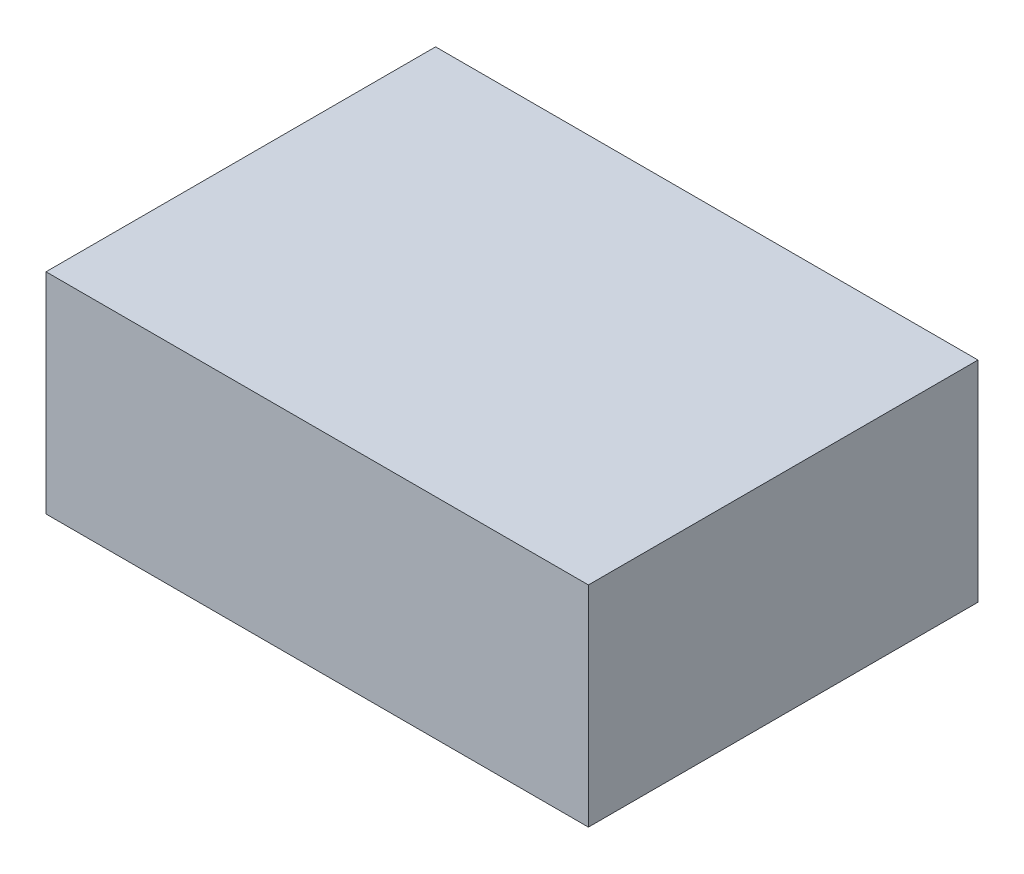
ISO-10303-21;
HEADER;
FILE_DESCRIPTION(('STEP AP214'),'2;1');
FILE_NAME('part.step','',(''),(''),'','','');
FILE_SCHEMA(('AUTOMOTIVE_DESIGN { 1 0 10303 214 1 1 1 1 }'));
ENDSEC;
DATA;
#1=APPLICATION_CONTEXT('core data for automotive mechanical design processes');
#2=APPLICATION_PROTOCOL_DEFINITION('international standard','automotive_design',2000,#1);
#3=PRODUCT_CONTEXT('',#1,'mechanical');
#4=PRODUCT('Part','Part','',(#3));
#5=PRODUCT_RELATED_PRODUCT_CATEGORY('part','',(#4));
#6=PRODUCT_DEFINITION_FORMATION('','',#4);
#7=PRODUCT_DEFINITION_CONTEXT('part definition',#1,'design');
#8=PRODUCT_DEFINITION('design','',#6,#7);
#9=PRODUCT_DEFINITION_SHAPE('','',#8);
#10=(LENGTH_UNIT() NAMED_UNIT(*) SI_UNIT(.MILLI.,.METRE.));
#11=(NAMED_UNIT(*) PLANE_ANGLE_UNIT() SI_UNIT($,.RADIAN.));
#12=(NAMED_UNIT(*) SI_UNIT($,.STERADIAN.) SOLID_ANGLE_UNIT());
#13=UNCERTAINTY_MEASURE_WITH_UNIT(LENGTH_MEASURE(1.E-05),#10,'distance_accuracy_value','');
#14=(GEOMETRIC_REPRESENTATION_CONTEXT(3) GLOBAL_UNCERTAINTY_ASSIGNED_CONTEXT((#13)) GLOBAL_UNIT_ASSIGNED_CONTEXT((#10,
#11,#12)) REPRESENTATION_CONTEXT('',''));
#15=CARTESIAN_POINT('',(0.,0.,0.));
#16=DIRECTION('',(0.,0.,1.));
#17=DIRECTION('',(1.,0.,0.));
#18=AXIS2_PLACEMENT_3D('',#15,#16,#17);
#19=CARTESIAN_POINT('',(-0.495,-1.55,0.65));
#20=DIRECTION('',(1.,0.,0.));
#21=DIRECTION('',(0.,0.,-1.));
#22=AXIS2_PLACEMENT_3D('',#19,#20,#21);
#23=PLANE('',#22);
#24=DIRECTION('',(0.,-1.,0.));
#25=VECTOR('',#24,1.);
#26=CARTESIAN_POINT('',(-0.495,-1.55,0.));
#27=LINE('',#26,#25);
#28=CARTESIAN_POINT('',(-0.495,-1.55,0.));
#29=VERTEX_POINT('',#28);
#30=CARTESIAN_POINT('',(-0.495,-1.9,0.));
#31=VERTEX_POINT('',#30);
#32=EDGE_CURVE('E11',#29,#31,#27,.T.);
#33=ORIENTED_EDGE('',*,*,#32,.F.);
#34=DIRECTION('',(0.,0.,-1.));
#35=VECTOR('',#34,1.);
#36=CARTESIAN_POINT('',(-0.495,-1.55,0.65));
#37=LINE('',#36,#35);
#38=CARTESIAN_POINT('',(-0.495,-1.55,0.65));
#39=VERTEX_POINT('',#38);
#40=EDGE_CURVE('E23',#39,#29,#37,.T.);
#41=ORIENTED_EDGE('',*,*,#40,.F.);
#42=DIRECTION('',(0.,-1.,0.));
#43=VECTOR('',#42,1.);
#44=CARTESIAN_POINT('',(-0.495,-1.55,0.65));
#45=LINE('',#44,#43);
#46=CARTESIAN_POINT('',(-0.495,-1.9,0.65));
#47=VERTEX_POINT('',#46);
#48=EDGE_CURVE('E87',#39,#47,#45,.T.);
#49=ORIENTED_EDGE('',*,*,#48,.T.);
#50=DIRECTION('',(0.,0.,-1.));
#51=VECTOR('',#50,1.);
#52=CARTESIAN_POINT('',(-0.495,-1.9,0.65));
#53=LINE('',#52,#51);
#54=EDGE_CURVE('E76',#47,#31,#53,.T.);
#55=ORIENTED_EDGE('',*,*,#54,.T.);
#56=EDGE_LOOP('',(#33,#41,#49,#55));
#57=FACE_BOUND('',#56,.T.);
#58=ADVANCED_FACE('F16',(#57),#23,.T.);
#59=CARTESIAN_POINT('',(-0.495,-1.55,0.65));
#60=DIRECTION('',(0.,1.,0.));
#61=DIRECTION('',(-1.,0.,0.));
#62=AXIS2_PLACEMENT_3D('',#59,#60,#61);
#63=PLANE('',#62);
#64=DIRECTION('',(1.,0.,0.));
#65=VECTOR('',#64,1.);
#66=CARTESIAN_POINT('',(-0.495,-1.55,0.));
#67=LINE('',#66,#65);
#68=CARTESIAN_POINT('',(-1.4,-1.55,0.));
#69=VERTEX_POINT('',#68);
#70=EDGE_CURVE('E84',#69,#29,#67,.T.);
#71=ORIENTED_EDGE('',*,*,#70,.F.);
#72=DIRECTION('',(0.,0.,-1.));
#73=VECTOR('',#72,1.);
#74=CARTESIAN_POINT('',(-1.4,-1.55,0.65));
#75=LINE('',#74,#73);
#76=CARTESIAN_POINT('',(-1.4,-1.55,0.65));
#77=VERTEX_POINT('',#76);
#78=EDGE_CURVE('E82',#77,#69,#75,.T.);
#79=ORIENTED_EDGE('',*,*,#78,.F.);
#80=DIRECTION('',(1.,0.,0.));
#81=VECTOR('',#80,1.);
#82=CARTESIAN_POINT('',(-0.495,-1.55,0.65));
#83=LINE('',#82,#81);
#84=EDGE_CURVE('E71',#77,#39,#83,.T.);
#85=ORIENTED_EDGE('',*,*,#84,.T.);
#86=ORIENTED_EDGE('',*,*,#40,.T.);
#87=EDGE_LOOP('',(#71,#79,#85,#86));
#88=FACE_BOUND('',#87,.T.);
#89=ADVANCED_FACE('F89',(#88),#63,.T.);
#90=CARTESIAN_POINT('',(-1.4,-1.55,0.65));
#91=DIRECTION('',(-1.,0.,0.));
#92=DIRECTION('',(0.,0.,1.));
#93=AXIS2_PLACEMENT_3D('',#90,#91,#92);
#94=PLANE('',#93);
#95=DIRECTION('',(0.,1.,0.));
#96=VECTOR('',#95,1.);
#97=CARTESIAN_POINT('',(-1.4,-1.55,0.));
#98=LINE('',#97,#96);
#99=CARTESIAN_POINT('',(-1.4,-1.9,0.));
#100=VERTEX_POINT('',#99);
#101=EDGE_CURVE('E59',#100,#69,#98,.T.);
#102=ORIENTED_EDGE('',*,*,#101,.F.);
#103=DIRECTION('',(0.,0.,-1.));
#104=VECTOR('',#103,1.);
#105=CARTESIAN_POINT('',(-1.4,-1.9,0.65));
#106=LINE('',#105,#104);
#107=CARTESIAN_POINT('',(-1.4,-1.9,0.65));
#108=VERTEX_POINT('',#107);
#109=EDGE_CURVE('E53',#108,#100,#106,.T.);
#110=ORIENTED_EDGE('',*,*,#109,.F.);
#111=DIRECTION('',(0.,1.,0.));
#112=VECTOR('',#111,1.);
#113=CARTESIAN_POINT('',(-1.4,-1.55,0.65));
#114=LINE('',#113,#112);
#115=EDGE_CURVE('E57',#108,#77,#114,.T.);
#116=ORIENTED_EDGE('',*,*,#115,.T.);
#117=ORIENTED_EDGE('',*,*,#78,.T.);
#118=EDGE_LOOP('',(#102,#110,#116,#117));
#119=FACE_BOUND('',#118,.T.);
#120=ADVANCED_FACE('F55',(#119),#94,.T.);
#121=CARTESIAN_POINT('',(-0.495,-1.9,0.65));
#122=DIRECTION('',(0.,-1.,0.));
#123=DIRECTION('',(1.,0.,0.));
#124=AXIS2_PLACEMENT_3D('',#121,#122,#123);
#125=PLANE('',#124);
#126=DIRECTION('',(-1.,0.,0.));
#127=VECTOR('',#126,1.);
#128=CARTESIAN_POINT('',(-0.495,-1.9,0.));
#129=LINE('',#128,#127);
#130=EDGE_CURVE('E72',#31,#100,#129,.T.);
#131=ORIENTED_EDGE('',*,*,#130,.F.);
#132=ORIENTED_EDGE('',*,*,#54,.F.);
#133=DIRECTION('',(-1.,0.,0.));
#134=VECTOR('',#133,1.);
#135=CARTESIAN_POINT('',(-0.495,-1.9,0.65));
#136=LINE('',#135,#134);
#137=EDGE_CURVE('E69',#47,#108,#136,.T.);
#138=ORIENTED_EDGE('',*,*,#137,.T.);
#139=ORIENTED_EDGE('',*,*,#109,.T.);
#140=EDGE_LOOP('',(#131,#132,#138,#139));
#141=FACE_BOUND('',#140,.T.);
#142=ADVANCED_FACE('F75',(#141),#125,.T.);
#143=CARTESIAN_POINT('',(0.,0.,0.65));
#144=DIRECTION('',(0.,0.,-1.));
#145=DIRECTION('',(-1.,0.,0.));
#146=AXIS2_PLACEMENT_3D('',#143,#144,#145);
#147=PLANE('',#146);
#148=ORIENTED_EDGE('',*,*,#48,.F.);
#149=ORIENTED_EDGE('',*,*,#84,.F.);
#150=ORIENTED_EDGE('',*,*,#115,.F.);
#151=ORIENTED_EDGE('',*,*,#137,.F.);
#152=EDGE_LOOP('',(#148,#149,#150,#151));
#153=FACE_BOUND('',#152,.T.);
#154=ADVANCED_FACE('F68',(#153),#147,.F.);
#155=CARTESIAN_POINT('',(0.,0.,0.));
#156=DIRECTION('',(0.,0.,-1.));
#157=DIRECTION('',(-1.,0.,0.));
#158=AXIS2_PLACEMENT_3D('',#155,#156,#157);
#159=PLANE('',#158);
#160=ORIENTED_EDGE('',*,*,#32,.T.);
#161=ORIENTED_EDGE('',*,*,#130,.T.);
#162=ORIENTED_EDGE('',*,*,#101,.T.);
#163=ORIENTED_EDGE('',*,*,#70,.T.);
#164=EDGE_LOOP('',(#160,#161,#162,#163));
#165=FACE_BOUND('',#164,.T.);
#166=ADVANCED_FACE('F90',(#165),#159,.T.);
#167=CLOSED_SHELL('',(#58,#89,#120,#142,#154,#166));
#168=MANIFOLD_SOLID_BREP('B1',#167);
#169=ADVANCED_BREP_SHAPE_REPRESENTATION('',(#18,#168),#14);
#170=SHAPE_DEFINITION_REPRESENTATION(#9,#169);
ENDSEC;
END-ISO-10303-21;
